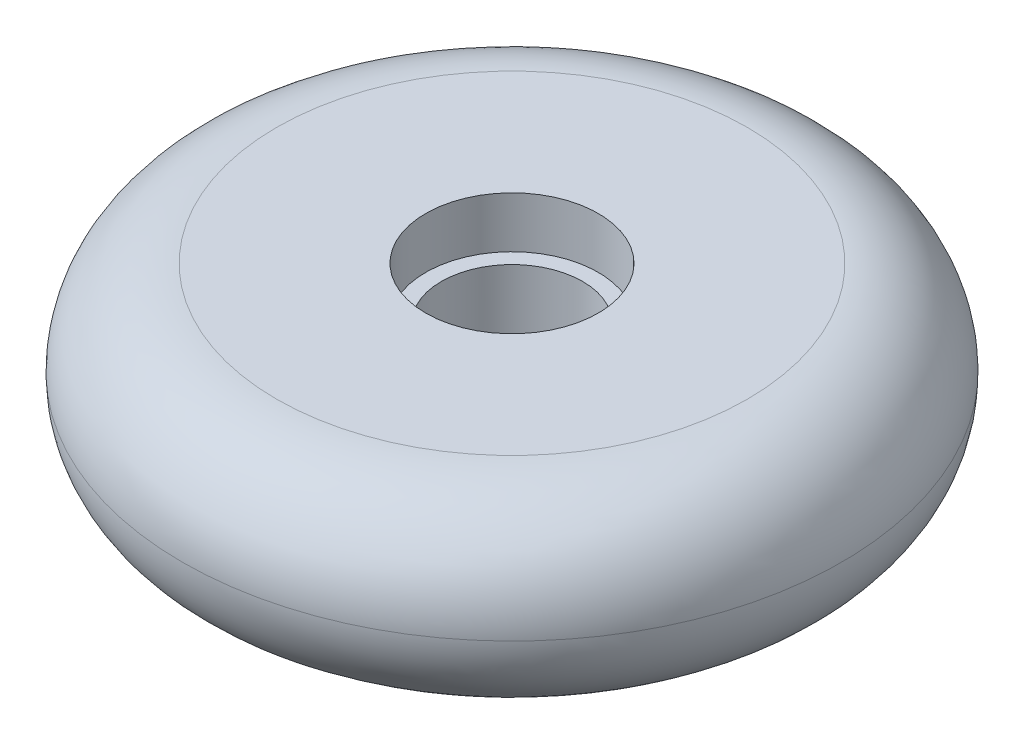
ISO-10303-21;
HEADER;
FILE_DESCRIPTION(('STEP AP214'),'2;1');
FILE_NAME('part.step','',(''),(''),'','','');
FILE_SCHEMA(('AUTOMOTIVE_DESIGN { 1 0 10303 214 1 1 1 1 }'));
ENDSEC;
DATA;
#1=APPLICATION_CONTEXT('core data for automotive mechanical design processes');
#2=APPLICATION_PROTOCOL_DEFINITION('international standard','automotive_design',2000,#1);
#3=PRODUCT_CONTEXT('',#1,'mechanical');
#4=PRODUCT('Part','Part','',(#3));
#5=PRODUCT_RELATED_PRODUCT_CATEGORY('part','',(#4));
#6=PRODUCT_DEFINITION_FORMATION('','',#4);
#7=PRODUCT_DEFINITION_CONTEXT('part definition',#1,'design');
#8=PRODUCT_DEFINITION('design','',#6,#7);
#9=PRODUCT_DEFINITION_SHAPE('','',#8);
#10=(LENGTH_UNIT() NAMED_UNIT(*) SI_UNIT(.MILLI.,.METRE.));
#11=(NAMED_UNIT(*) PLANE_ANGLE_UNIT() SI_UNIT($,.RADIAN.));
#12=(NAMED_UNIT(*) SI_UNIT($,.STERADIAN.) SOLID_ANGLE_UNIT());
#13=UNCERTAINTY_MEASURE_WITH_UNIT(LENGTH_MEASURE(1.E-05),#10,'distance_accuracy_value','');
#14=(GEOMETRIC_REPRESENTATION_CONTEXT(3) GLOBAL_UNCERTAINTY_ASSIGNED_CONTEXT((#13)) GLOBAL_UNIT_ASSIGNED_CONTEXT((#10,
#11,#12)) REPRESENTATION_CONTEXT('',''));
#15=CARTESIAN_POINT('',(0.,0.,0.));
#16=DIRECTION('',(0.,0.,1.));
#17=DIRECTION('',(1.,0.,0.));
#18=AXIS2_PLACEMENT_3D('',#15,#16,#17);
#19=CARTESIAN_POINT('',(0.,24.,0.));
#20=DIRECTION('',(0.,1.,0.));
#21=DIRECTION('',(0.,0.,1.));
#22=AXIS2_PLACEMENT_3D('',#19,#20,#21);
#23=PLANE('',#22);
#24=CARTESIAN_POINT('',(0.,24.,0.));
#25=DIRECTION('',(0.,1.,0.));
#26=DIRECTION('',(0.,0.,1.));
#27=AXIS2_PLACEMENT_3D('',#24,#25,#26);
#28=CIRCLE('',#27,11.);
#29=CARTESIAN_POINT('',(0.,24.,11.));
#30=VERTEX_POINT('',#29);
#31=EDGE_CURVE('E45',#30,#30,#28,.T.);
#32=ORIENTED_EDGE('',*,*,#31,.F.);
#33=EDGE_LOOP('',(#32));
#34=FACE_BOUND('',#33,.T.);
#35=CARTESIAN_POINT('',(0.,24.,0.));
#36=DIRECTION('',(0.,1.,0.));
#37=DIRECTION('',(0.,0.,1.));
#38=AXIS2_PLACEMENT_3D('',#35,#36,#37);
#39=CIRCLE('',#38,30.);
#40=CARTESIAN_POINT('',(0.,24.,30.));
#41=VERTEX_POINT('',#40);
#42=EDGE_CURVE('E10',#41,#41,#39,.T.);
#43=ORIENTED_EDGE('',*,*,#42,.T.);
#44=EDGE_LOOP('',(#43));
#45=FACE_BOUND('',#44,.T.);
#46=ADVANCED_FACE('F31',(#34,#45),#23,.T.);
#47=CARTESIAN_POINT('',(0.,0.,0.));
#48=DIRECTION('',(0.,1.,0.));
#49=DIRECTION('',(0.,0.,1.));
#50=AXIS2_PLACEMENT_3D('',#47,#48,#49);
#51=PLANE('',#50);
#52=CARTESIAN_POINT('',(0.,0.,0.));
#53=DIRECTION('',(0.,-1.,0.));
#54=DIRECTION('',(0.,0.,-1.));
#55=AXIS2_PLACEMENT_3D('',#52,#53,#54);
#56=CIRCLE('',#55,11.);
#57=CARTESIAN_POINT('',(0.,0.,-11.));
#58=VERTEX_POINT('',#57);
#59=EDGE_CURVE('E52',#58,#58,#56,.T.);
#60=ORIENTED_EDGE('',*,*,#59,.F.);
#61=EDGE_LOOP('',(#60));
#62=FACE_BOUND('',#61,.T.);
#63=CARTESIAN_POINT('',(0.,0.,0.));
#64=DIRECTION('',(0.,1.,0.));
#65=DIRECTION('',(0.,0.,1.));
#66=AXIS2_PLACEMENT_3D('',#63,#64,#65);
#67=CIRCLE('',#66,30.);
#68=CARTESIAN_POINT('',(0.,0.,30.));
#69=VERTEX_POINT('',#68);
#70=EDGE_CURVE('E39',#69,#69,#67,.F.);
#71=ORIENTED_EDGE('',*,*,#70,.T.);
#72=EDGE_LOOP('',(#71));
#73=FACE_BOUND('',#72,.T.);
#74=ADVANCED_FACE('F79',(#62,#73),#51,.F.);
#75=CARTESIAN_POINT('',(0.,12.,0.));
#76=DIRECTION('',(0.,1.,0.));
#77=DIRECTION('',(0.,0.,1.));
#78=AXIS2_PLACEMENT_3D('',#75,#76,#77);
#79=TOROIDAL_SURFACE('',#78,30.,12.);
#80=ORIENTED_EDGE('',*,*,#42,.F.);
#81=EDGE_LOOP('',(#80));
#82=FACE_BOUND('',#81,.T.);
#83=CARTESIAN_POINT('',(0.,12.,0.));
#84=DIRECTION('',(0.,1.,0.));
#85=DIRECTION('',(0.,0.,1.));
#86=AXIS2_PLACEMENT_3D('',#83,#84,#85);
#87=CIRCLE('',#86,42.);
#88=CARTESIAN_POINT('',(0.,12.,42.));
#89=VERTEX_POINT('',#88);
#90=EDGE_CURVE('E35',#89,#89,#87,.F.);
#91=ORIENTED_EDGE('',*,*,#90,.F.);
#92=EDGE_LOOP('',(#91));
#93=FACE_BOUND('',#92,.T.);
#94=ADVANCED_FACE('F33',(#82,#93),#79,.T.);
#95=CARTESIAN_POINT('',(0.,12.,0.));
#96=DIRECTION('',(0.,1.,0.));
#97=DIRECTION('',(0.,0.,1.));
#98=AXIS2_PLACEMENT_3D('',#95,#96,#97);
#99=TOROIDAL_SURFACE('',#98,30.,12.);
#100=ORIENTED_EDGE('',*,*,#70,.F.);
#101=EDGE_LOOP('',(#100));
#102=FACE_BOUND('',#101,.T.);
#103=ORIENTED_EDGE('',*,*,#90,.T.);
#104=EDGE_LOOP('',(#103));
#105=FACE_BOUND('',#104,.T.);
#106=ADVANCED_FACE('F85',(#102,#105),#99,.T.);
#107=CARTESIAN_POINT('',(0.,17.5,0.));
#108=DIRECTION('',(0.,1.,0.));
#109=DIRECTION('',(0.,0.,1.));
#110=AXIS2_PLACEMENT_3D('',#107,#108,#109);
#111=CYLINDRICAL_SURFACE('',#110,11.);
#112=CARTESIAN_POINT('',(0.,17.5,0.));
#113=DIRECTION('',(0.,1.,0.));
#114=DIRECTION('',(0.,0.,1.));
#115=AXIS2_PLACEMENT_3D('',#112,#113,#114);
#116=CIRCLE('',#115,11.);
#117=CARTESIAN_POINT('',(0.,17.5,11.));
#118=VERTEX_POINT('',#117);
#119=EDGE_CURVE('E48',#118,#118,#116,.T.);
#120=CARTESIAN_POINT('',(0.,17.5,11.));
#121=CARTESIAN_POINT('',(0.,17.5677083333333,11.));
#122=CARTESIAN_POINT('',(0.,17.6354166666667,11.));
#123=CARTESIAN_POINT('',(0.,17.7708333333333,11.));
#124=CARTESIAN_POINT('',(0.,17.8385416666667,11.));
#125=CARTESIAN_POINT('',(0.,17.9739583333333,11.));
#126=CARTESIAN_POINT('',(0.,18.0416666666667,11.));
#127=CARTESIAN_POINT('',(0.,18.1770833333333,11.));
#128=CARTESIAN_POINT('',(0.,18.2447916666667,11.));
#129=CARTESIAN_POINT('',(0.,18.3802083333333,11.));
#130=CARTESIAN_POINT('',(0.,18.4479166666667,11.));
#131=CARTESIAN_POINT('',(0.,18.5833333333333,11.));
#132=CARTESIAN_POINT('',(0.,18.6510416666667,11.));
#133=CARTESIAN_POINT('',(0.,18.7864583333333,11.));
#134=CARTESIAN_POINT('',(0.,18.8541666666667,11.));
#135=CARTESIAN_POINT('',(0.,18.9895833333333,11.));
#136=CARTESIAN_POINT('',(0.,19.0572916666667,11.));
#137=CARTESIAN_POINT('',(0.,19.1927083333333,11.));
#138=CARTESIAN_POINT('',(0.,19.2604166666667,11.));
#139=CARTESIAN_POINT('',(0.,19.3958333333333,11.));
#140=CARTESIAN_POINT('',(0.,19.4635416666667,11.));
#141=CARTESIAN_POINT('',(0.,19.5989583333333,11.));
#142=CARTESIAN_POINT('',(0.,19.6666666666667,11.));
#143=CARTESIAN_POINT('',(0.,19.8020833333333,11.));
#144=CARTESIAN_POINT('',(0.,19.8697916666667,11.));
#145=CARTESIAN_POINT('',(0.,20.0052083333333,11.));
#146=CARTESIAN_POINT('',(0.,20.0729166666667,11.));
#147=CARTESIAN_POINT('',(0.,20.2083333333333,11.));
#148=CARTESIAN_POINT('',(0.,20.2760416666667,11.));
#149=CARTESIAN_POINT('',(0.,20.4114583333333,11.));
#150=CARTESIAN_POINT('',(0.,20.4791666666667,11.));
#151=CARTESIAN_POINT('',(0.,20.6145833333333,11.));
#152=CARTESIAN_POINT('',(0.,20.6822916666667,11.));
#153=CARTESIAN_POINT('',(0.,20.8177083333333,11.));
#154=CARTESIAN_POINT('',(0.,20.8854166666667,11.));
#155=CARTESIAN_POINT('',(0.,21.0208333333333,11.));
#156=CARTESIAN_POINT('',(0.,21.0885416666667,11.));
#157=CARTESIAN_POINT('',(0.,21.2239583333333,11.));
#158=CARTESIAN_POINT('',(0.,21.2916666666667,11.));
#159=CARTESIAN_POINT('',(0.,21.4270833333333,11.));
#160=CARTESIAN_POINT('',(0.,21.4947916666667,11.));
#161=CARTESIAN_POINT('',(0.,21.6302083333333,11.));
#162=CARTESIAN_POINT('',(0.,21.6979166666667,11.));
#163=CARTESIAN_POINT('',(0.,21.8333333333333,11.));
#164=CARTESIAN_POINT('',(0.,21.9010416666667,11.));
#165=CARTESIAN_POINT('',(0.,22.0364583333333,11.));
#166=CARTESIAN_POINT('',(0.,22.1041666666667,11.));
#167=CARTESIAN_POINT('',(0.,22.2395833333333,11.));
#168=CARTESIAN_POINT('',(0.,22.3072916666667,11.));
#169=CARTESIAN_POINT('',(0.,22.4427083333333,11.));
#170=CARTESIAN_POINT('',(0.,22.5104166666667,11.));
#171=CARTESIAN_POINT('',(0.,22.6458333333333,11.));
#172=CARTESIAN_POINT('',(0.,22.7135416666667,11.));
#173=CARTESIAN_POINT('',(0.,22.8489583333333,11.));
#174=CARTESIAN_POINT('',(0.,22.9166666666667,11.));
#175=CARTESIAN_POINT('',(0.,23.0520833333333,11.));
#176=CARTESIAN_POINT('',(0.,23.1197916666667,11.));
#177=CARTESIAN_POINT('',(0.,23.2552083333333,11.));
#178=CARTESIAN_POINT('',(0.,23.3229166666667,11.));
#179=CARTESIAN_POINT('',(0.,23.4583333333333,11.));
#180=CARTESIAN_POINT('',(0.,23.5260416666667,11.));
#181=CARTESIAN_POINT('',(0.,23.6614583333333,11.));
#182=CARTESIAN_POINT('',(0.,23.7291666666667,11.));
#183=CARTESIAN_POINT('',(0.,23.8645833333333,11.));
#184=CARTESIAN_POINT('',(0.,23.9322916666667,11.));
#185=CARTESIAN_POINT('',(0.,24.,11.));
#186=B_SPLINE_CURVE_WITH_KNOTS('',3,(#120,#121,#122,#123,#124,#125,#126,#127,#128,#129,#130,
#131,#132,#133,#134,#135,#136,#137,#138,#139,#140,#141,#142,#143,#144,#145,#146,#147,#148,#149,
#150,#151,#152,#153,#154,#155,#156,#157,#158,#159,#160,#161,#162,#163,#164,#165,#166,#167,#168,
#169,#170,#171,#172,#173,#174,#175,#176,#177,#178,#179,#180,#181,#182,#183,#184,#185),
.UNSPECIFIED.,.F.,.F.,(4,2,2,2,2,2,2,2,2,2,2,2,2,2,2,2,2,2,2,2,2,2,2,2,2,2,2,2,2,2,2,2,4),(0.,
0.203125000000002,0.40625,0.609375000000002,0.812500000000001,1.015625,1.21875,1.421875,1.625,
1.828125,2.03125,2.234375,2.4375,2.640625,2.84375,3.046875,3.25,3.453125,3.65625,3.859375,
4.0625,4.265625,4.46875,4.671875,4.875,5.078125,5.28125,5.484375,5.6875,5.890625,6.09375,
6.296875,6.5),.UNSPECIFIED.);
#187=EDGE_CURVE('BSEAM88',#118,#30,#186,.T.);
#188=ORIENTED_EDGE('',*,*,#119,.F.);
#189=ORIENTED_EDGE('',*,*,#31,.T.);
#190=ORIENTED_EDGE('',*,*,#187,.T.);
#191=ORIENTED_EDGE('',*,*,#187,.F.);
#192=EDGE_LOOP('',(#188,#190,#189,#191));
#193=FACE_BOUND('',#192,.T.);
#194=ADVANCED_FACE('F88',(#193),#111,.F.);
#195=CARTESIAN_POINT('',(0.,17.5,0.));
#196=DIRECTION('',(0.,1.,0.));
#197=DIRECTION('',(0.,0.,1.));
#198=AXIS2_PLACEMENT_3D('',#195,#196,#197);
#199=PLANE('',#198);
#200=CARTESIAN_POINT('',(0.,17.5,0.));
#201=DIRECTION('',(0.,1.,0.));
#202=DIRECTION('',(0.,0.,1.));
#203=AXIS2_PLACEMENT_3D('',#200,#201,#202);
#204=CIRCLE('',#203,9.);
#205=CARTESIAN_POINT('',(0.,17.5,9.));
#206=VERTEX_POINT('',#205);
#207=EDGE_CURVE('E55',#206,#206,#204,.T.);
#208=ORIENTED_EDGE('',*,*,#207,.F.);
#209=EDGE_LOOP('',(#208));
#210=FACE_BOUND('',#209,.T.);
#211=ORIENTED_EDGE('',*,*,#119,.T.);
#212=EDGE_LOOP('',(#211));
#213=FACE_BOUND('',#212,.T.);
#214=ADVANCED_FACE('F75',(#210,#213),#199,.T.);
#215=CARTESIAN_POINT('',(0.,6.5,0.));
#216=DIRECTION('',(0.,-1.,0.));
#217=DIRECTION('',(0.,0.,-1.));
#218=AXIS2_PLACEMENT_3D('',#215,#216,#217);
#219=CYLINDRICAL_SURFACE('',#218,11.);
#220=CARTESIAN_POINT('',(0.,6.5,0.));
#221=DIRECTION('',(0.,-1.,0.));
#222=DIRECTION('',(0.,0.,-1.));
#223=AXIS2_PLACEMENT_3D('',#220,#221,#222);
#224=CIRCLE('',#223,11.);
#225=CARTESIAN_POINT('',(0.,6.5,-11.));
#226=VERTEX_POINT('',#225);
#227=EDGE_CURVE('E49',#226,#226,#224,.T.);
#228=CARTESIAN_POINT('',(0.,6.5,-11.));
#229=CARTESIAN_POINT('',(0.,6.43229166666667,-11.));
#230=CARTESIAN_POINT('',(0.,6.36458333333333,-11.));
#231=CARTESIAN_POINT('',(0.,6.22916666666667,-11.));
#232=CARTESIAN_POINT('',(0.,6.16145833333333,-11.));
#233=CARTESIAN_POINT('',(0.,6.02604166666667,-11.));
#234=CARTESIAN_POINT('',(0.,5.95833333333333,-11.));
#235=CARTESIAN_POINT('',(0.,5.82291666666667,-11.));
#236=CARTESIAN_POINT('',(0.,5.75520833333333,-11.));
#237=CARTESIAN_POINT('',(0.,5.61979166666667,-11.));
#238=CARTESIAN_POINT('',(0.,5.55208333333333,-11.));
#239=CARTESIAN_POINT('',(0.,5.41666666666667,-11.));
#240=CARTESIAN_POINT('',(0.,5.34895833333333,-11.));
#241=CARTESIAN_POINT('',(0.,5.21354166666667,-11.));
#242=CARTESIAN_POINT('',(0.,5.14583333333333,-11.));
#243=CARTESIAN_POINT('',(0.,5.01041666666667,-11.));
#244=CARTESIAN_POINT('',(0.,4.94270833333333,-11.));
#245=CARTESIAN_POINT('',(0.,4.80729166666667,-11.));
#246=CARTESIAN_POINT('',(0.,4.73958333333333,-11.));
#247=CARTESIAN_POINT('',(0.,4.60416666666667,-11.));
#248=CARTESIAN_POINT('',(0.,4.53645833333333,-11.));
#249=CARTESIAN_POINT('',(0.,4.40104166666667,-11.));
#250=CARTESIAN_POINT('',(0.,4.33333333333333,-11.));
#251=CARTESIAN_POINT('',(0.,4.19791666666667,-11.));
#252=CARTESIAN_POINT('',(0.,4.13020833333333,-11.));
#253=CARTESIAN_POINT('',(0.,3.99479166666667,-11.));
#254=CARTESIAN_POINT('',(0.,3.92708333333333,-11.));
#255=CARTESIAN_POINT('',(0.,3.79166666666667,-11.));
#256=CARTESIAN_POINT('',(0.,3.72395833333333,-11.));
#257=CARTESIAN_POINT('',(0.,3.58854166666667,-11.));
#258=CARTESIAN_POINT('',(0.,3.52083333333333,-11.));
#259=CARTESIAN_POINT('',(0.,3.38541666666667,-11.));
#260=CARTESIAN_POINT('',(0.,3.31770833333333,-11.));
#261=CARTESIAN_POINT('',(0.,3.18229166666667,-11.));
#262=CARTESIAN_POINT('',(0.,3.11458333333333,-11.));
#263=CARTESIAN_POINT('',(0.,2.97916666666667,-11.));
#264=CARTESIAN_POINT('',(0.,2.91145833333333,-11.));
#265=CARTESIAN_POINT('',(0.,2.77604166666667,-11.));
#266=CARTESIAN_POINT('',(0.,2.70833333333333,-11.));
#267=CARTESIAN_POINT('',(0.,2.57291666666667,-11.));
#268=CARTESIAN_POINT('',(0.,2.50520833333333,-11.));
#269=CARTESIAN_POINT('',(0.,2.36979166666667,-11.));
#270=CARTESIAN_POINT('',(0.,2.30208333333333,-11.));
#271=CARTESIAN_POINT('',(0.,2.16666666666667,-11.));
#272=CARTESIAN_POINT('',(0.,2.09895833333333,-11.));
#273=CARTESIAN_POINT('',(0.,1.96354166666667,-11.));
#274=CARTESIAN_POINT('',(0.,1.89583333333333,-11.));
#275=CARTESIAN_POINT('',(0.,1.76041666666667,-11.));
#276=CARTESIAN_POINT('',(0.,1.69270833333333,-11.));
#277=CARTESIAN_POINT('',(0.,1.55729166666667,-11.));
#278=CARTESIAN_POINT('',(0.,1.48958333333333,-11.));
#279=CARTESIAN_POINT('',(0.,1.35416666666667,-11.));
#280=CARTESIAN_POINT('',(0.,1.28645833333333,-11.));
#281=CARTESIAN_POINT('',(0.,1.15104166666667,-11.));
#282=CARTESIAN_POINT('',(0.,1.08333333333333,-11.));
#283=CARTESIAN_POINT('',(0.,0.947916666666667,-11.));
#284=CARTESIAN_POINT('',(0.,0.880208333333333,-11.));
#285=CARTESIAN_POINT('',(0.,0.744791666666667,-11.));
#286=CARTESIAN_POINT('',(0.,0.677083333333334,-11.));
#287=CARTESIAN_POINT('',(0.,0.541666666666667,-11.));
#288=CARTESIAN_POINT('',(0.,0.473958333333334,-11.));
#289=CARTESIAN_POINT('',(0.,0.338541666666667,-11.));
#290=CARTESIAN_POINT('',(0.,0.270833333333334,-11.));
#291=CARTESIAN_POINT('',(0.,0.135416666666667,-11.));
#292=CARTESIAN_POINT('',(0.,0.0677083333333333,-11.));
#293=CARTESIAN_POINT('',(0.,0.,-11.));
#294=B_SPLINE_CURVE_WITH_KNOTS('',3,(#228,#229,#230,#231,#232,#233,#234,#235,#236,#237,#238,
#239,#240,#241,#242,#243,#244,#245,#246,#247,#248,#249,#250,#251,#252,#253,#254,#255,#256,#257,
#258,#259,#260,#261,#262,#263,#264,#265,#266,#267,#268,#269,#270,#271,#272,#273,#274,#275,#276,
#277,#278,#279,#280,#281,#282,#283,#284,#285,#286,#287,#288,#289,#290,#291,#292,#293),
.UNSPECIFIED.,.F.,.F.,(4,2,2,2,2,2,2,2,2,2,2,2,2,2,2,2,2,2,2,2,2,2,2,2,2,2,2,2,2,2,2,2,4),(0.,
0.203125,0.40625,0.609375000000001,0.812500000000001,1.015625,1.21875,1.421875,1.625,1.828125,
2.03125,2.234375,2.4375,2.640625,2.84375,3.046875,3.25,3.453125,3.65625,3.859375,4.0625,
4.265625,4.46875,4.671875,4.875,5.078125,5.28125,5.484375,5.6875,5.890625,6.09375,6.296875,6.5),.UNSPECIFIED.);
#295=EDGE_CURVE('BSEAM69',#226,#58,#294,.T.);
#296=ORIENTED_EDGE('',*,*,#227,.F.);
#297=ORIENTED_EDGE('',*,*,#59,.T.);
#298=ORIENTED_EDGE('',*,*,#295,.T.);
#299=ORIENTED_EDGE('',*,*,#295,.F.);
#300=EDGE_LOOP('',(#296,#298,#297,#299));
#301=FACE_BOUND('',#300,.T.);
#302=ADVANCED_FACE('F69',(#301),#219,.F.);
#303=CARTESIAN_POINT('',(0.,6.5,0.));
#304=DIRECTION('',(0.,-1.,0.));
#305=DIRECTION('',(0.,0.,-1.));
#306=AXIS2_PLACEMENT_3D('',#303,#304,#305);
#307=PLANE('',#306);
#308=CARTESIAN_POINT('',(0.,6.5,0.));
#309=DIRECTION('',(0.,-1.,0.));
#310=DIRECTION('',(0.,0.,-1.));
#311=AXIS2_PLACEMENT_3D('',#308,#309,#310);
#312=CIRCLE('',#311,9.);
#313=CARTESIAN_POINT('',(0.,6.5,-9.));
#314=VERTEX_POINT('',#313);
#315=EDGE_CURVE('E60',#314,#314,#312,.T.);
#316=ORIENTED_EDGE('',*,*,#315,.F.);
#317=EDGE_LOOP('',(#316));
#318=FACE_BOUND('',#317,.T.);
#319=ORIENTED_EDGE('',*,*,#227,.T.);
#320=EDGE_LOOP('',(#319));
#321=FACE_BOUND('',#320,.T.);
#322=ADVANCED_FACE('F66',(#318,#321),#307,.T.);
#323=CARTESIAN_POINT('',(0.,24.,0.));
#324=DIRECTION('',(0.,-1.,0.));
#325=DIRECTION('',(0.,0.,-1.));
#326=AXIS2_PLACEMENT_3D('',#323,#324,#325);
#327=CYLINDRICAL_SURFACE('',#326,9.);
#328=ORIENTED_EDGE('',*,*,#207,.T.);
#329=EDGE_LOOP('',(#328));
#330=FACE_BOUND('',#329,.T.);
#331=ORIENTED_EDGE('',*,*,#315,.T.);
#332=EDGE_LOOP('',(#331));
#333=FACE_BOUND('',#332,.T.);
#334=ADVANCED_FACE('F64',(#330,#333),#327,.F.);
#335=CLOSED_SHELL('',(#46,#74,#94,#106,#194,#214,#302,#322,#334));
#336=MANIFOLD_SOLID_BREP('B2',#335);
#337=ADVANCED_BREP_SHAPE_REPRESENTATION('',(#18,#336),#14);
#338=SHAPE_DEFINITION_REPRESENTATION(#9,#337);
ENDSEC;
END-ISO-10303-21;
